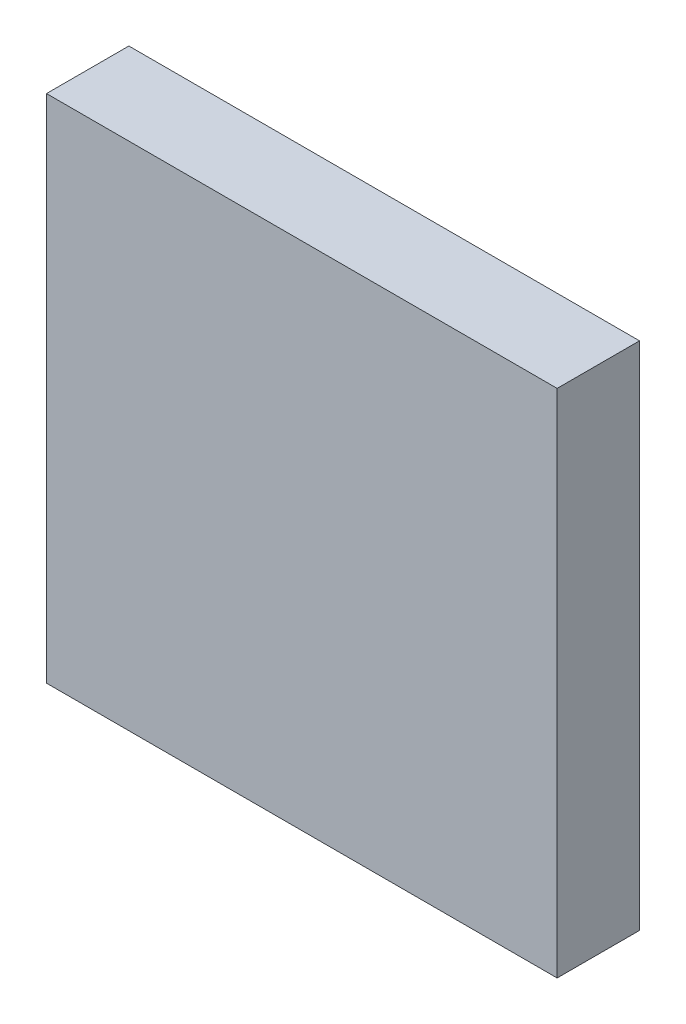
ISO-10303-21;
HEADER;
FILE_DESCRIPTION(('STEP AP214'),'2;1');
FILE_NAME('part.step','',(''),(''),'','','');
FILE_SCHEMA(('AUTOMOTIVE_DESIGN { 1 0 10303 214 1 1 1 1 }'));
ENDSEC;
DATA;
#1=APPLICATION_CONTEXT('core data for automotive mechanical design processes');
#2=APPLICATION_PROTOCOL_DEFINITION('international standard','automotive_design',2000,#1);
#3=PRODUCT_CONTEXT('',#1,'mechanical');
#4=PRODUCT('Part','Part','',(#3));
#5=PRODUCT_RELATED_PRODUCT_CATEGORY('part','',(#4));
#6=PRODUCT_DEFINITION_FORMATION('','',#4);
#7=PRODUCT_DEFINITION_CONTEXT('part definition',#1,'design');
#8=PRODUCT_DEFINITION('design','',#6,#7);
#9=PRODUCT_DEFINITION_SHAPE('','',#8);
#10=(LENGTH_UNIT() NAMED_UNIT(*) SI_UNIT(.MILLI.,.METRE.));
#11=(NAMED_UNIT(*) PLANE_ANGLE_UNIT() SI_UNIT($,.RADIAN.));
#12=(NAMED_UNIT(*) SI_UNIT($,.STERADIAN.) SOLID_ANGLE_UNIT());
#13=UNCERTAINTY_MEASURE_WITH_UNIT(LENGTH_MEASURE(1.E-05),#10,'distance_accuracy_value','');
#14=(GEOMETRIC_REPRESENTATION_CONTEXT(3) GLOBAL_UNCERTAINTY_ASSIGNED_CONTEXT((#13)) GLOBAL_UNIT_ASSIGNED_CONTEXT((#10,
#11,#12)) REPRESENTATION_CONTEXT('',''));
#15=CARTESIAN_POINT('',(0.,0.,0.));
#16=DIRECTION('',(0.,0.,1.));
#17=DIRECTION('',(1.,0.,0.));
#18=AXIS2_PLACEMENT_3D('',#15,#16,#17);
#19=CARTESIAN_POINT('',(-31.,-31.,10.));
#20=DIRECTION('',(0.,1.,0.));
#21=DIRECTION('',(0.,0.,1.));
#22=AXIS2_PLACEMENT_3D('',#19,#20,#21);
#23=PLANE('',#22);
#24=DIRECTION('',(1.,0.,0.));
#25=VECTOR('',#24,1.);
#26=CARTESIAN_POINT('',(-31.,-31.,0.));
#27=LINE('',#26,#25);
#28=CARTESIAN_POINT('',(-31.,-31.,0.));
#29=VERTEX_POINT('',#28);
#30=CARTESIAN_POINT('',(31.,-31.,0.));
#31=VERTEX_POINT('',#30);
#32=EDGE_CURVE('E138',#29,#31,#27,.T.);
#33=ORIENTED_EDGE('',*,*,#32,.T.);
#34=DIRECTION('',(0.,0.,-1.));
#35=VECTOR('',#34,1.);
#36=CARTESIAN_POINT('',(31.,-31.,10.));
#37=LINE('',#36,#35);
#38=CARTESIAN_POINT('',(31.,-31.,10.));
#39=VERTEX_POINT('',#38);
#40=EDGE_CURVE('E12',#39,#31,#37,.T.);
#41=ORIENTED_EDGE('',*,*,#40,.F.);
#42=DIRECTION('',(1.,0.,0.));
#43=VECTOR('',#42,1.);
#44=CARTESIAN_POINT('',(-31.,-31.,10.));
#45=LINE('',#44,#43);
#46=CARTESIAN_POINT('',(-31.,-31.,10.));
#47=VERTEX_POINT('',#46);
#48=EDGE_CURVE('E100',#47,#39,#45,.T.);
#49=ORIENTED_EDGE('',*,*,#48,.F.);
#50=DIRECTION('',(0.,0.,-1.));
#51=VECTOR('',#50,1.);
#52=CARTESIAN_POINT('',(-31.,-31.,10.));
#53=LINE('',#52,#51);
#54=EDGE_CURVE('E67',#47,#29,#53,.T.);
#55=ORIENTED_EDGE('',*,*,#54,.T.);
#56=EDGE_LOOP('',(#33,#41,#49,#55));
#57=FACE_BOUND('',#56,.T.);
#58=ADVANCED_FACE('F50',(#57),#23,.F.);
#59=CARTESIAN_POINT('',(31.,-31.,10.));
#60=DIRECTION('',(-1.,0.,0.));
#61=DIRECTION('',(0.,0.,1.));
#62=AXIS2_PLACEMENT_3D('',#59,#60,#61);
#63=PLANE('',#62);
#64=DIRECTION('',(0.,1.,0.));
#65=VECTOR('',#64,1.);
#66=CARTESIAN_POINT('',(31.,-31.,0.));
#67=LINE('',#66,#65);
#68=CARTESIAN_POINT('',(31.,31.,0.));
#69=VERTEX_POINT('',#68);
#70=EDGE_CURVE('E106',#31,#69,#67,.T.);
#71=ORIENTED_EDGE('',*,*,#70,.T.);
#72=DIRECTION('',(0.,0.,-1.));
#73=VECTOR('',#72,1.);
#74=CARTESIAN_POINT('',(31.,31.,10.));
#75=LINE('',#74,#73);
#76=CARTESIAN_POINT('',(31.,31.,10.));
#77=VERTEX_POINT('',#76);
#78=EDGE_CURVE('E59',#77,#69,#75,.T.);
#79=ORIENTED_EDGE('',*,*,#78,.F.);
#80=DIRECTION('',(0.,1.,0.));
#81=VECTOR('',#80,1.);
#82=CARTESIAN_POINT('',(31.,-31.,10.));
#83=LINE('',#82,#81);
#84=EDGE_CURVE('E92',#39,#77,#83,.T.);
#85=ORIENTED_EDGE('',*,*,#84,.F.);
#86=ORIENTED_EDGE('',*,*,#40,.T.);
#87=EDGE_LOOP('',(#71,#79,#85,#86));
#88=FACE_BOUND('',#87,.T.);
#89=ADVANCED_FACE('F105',(#88),#63,.F.);
#90=CARTESIAN_POINT('',(-31.,31.,10.));
#91=DIRECTION('',(0.,1.,0.));
#92=DIRECTION('',(0.,0.,1.));
#93=AXIS2_PLACEMENT_3D('',#90,#91,#92);
#94=PLANE('',#93);
#95=DIRECTION('',(1.,0.,0.));
#96=VECTOR('',#95,1.);
#97=CARTESIAN_POINT('',(-31.,31.,0.));
#98=LINE('',#97,#96);
#99=CARTESIAN_POINT('',(-31.,31.,0.));
#100=VERTEX_POINT('',#99);
#101=EDGE_CURVE('E127',#100,#69,#98,.T.);
#102=ORIENTED_EDGE('',*,*,#101,.F.);
#103=DIRECTION('',(0.,0.,-1.));
#104=VECTOR('',#103,1.);
#105=CARTESIAN_POINT('',(-31.,31.,10.));
#106=LINE('',#105,#104);
#107=CARTESIAN_POINT('',(-31.,31.,10.));
#108=VERTEX_POINT('',#107);
#109=EDGE_CURVE('E81',#108,#100,#106,.T.);
#110=ORIENTED_EDGE('',*,*,#109,.F.);
#111=DIRECTION('',(1.,0.,0.));
#112=VECTOR('',#111,1.);
#113=CARTESIAN_POINT('',(-31.,31.,10.));
#114=LINE('',#113,#112);
#115=EDGE_CURVE('E99',#108,#77,#114,.T.);
#116=ORIENTED_EDGE('',*,*,#115,.T.);
#117=ORIENTED_EDGE('',*,*,#78,.T.);
#118=EDGE_LOOP('',(#102,#110,#116,#117));
#119=FACE_BOUND('',#118,.T.);
#120=ADVANCED_FACE('F110',(#119),#94,.T.);
#121=CARTESIAN_POINT('',(-31.,-31.,10.));
#122=DIRECTION('',(-1.,0.,0.));
#123=DIRECTION('',(0.,0.,1.));
#124=AXIS2_PLACEMENT_3D('',#121,#122,#123);
#125=PLANE('',#124);
#126=DIRECTION('',(0.,1.,0.));
#127=VECTOR('',#126,1.);
#128=CARTESIAN_POINT('',(-31.,-31.,0.));
#129=LINE('',#128,#127);
#130=EDGE_CURVE('E124',#29,#100,#129,.T.);
#131=ORIENTED_EDGE('',*,*,#130,.F.);
#132=ORIENTED_EDGE('',*,*,#54,.F.);
#133=DIRECTION('',(0.,1.,0.));
#134=VECTOR('',#133,1.);
#135=CARTESIAN_POINT('',(-31.,-31.,10.));
#136=LINE('',#135,#134);
#137=EDGE_CURVE('E112',#47,#108,#136,.T.);
#138=ORIENTED_EDGE('',*,*,#137,.T.);
#139=ORIENTED_EDGE('',*,*,#109,.T.);
#140=EDGE_LOOP('',(#131,#132,#138,#139));
#141=FACE_BOUND('',#140,.T.);
#142=ADVANCED_FACE('F141',(#141),#125,.T.);
#143=CARTESIAN_POINT('',(0.,0.,10.));
#144=DIRECTION('',(0.,0.,1.));
#145=DIRECTION('',(1.,0.,0.));
#146=AXIS2_PLACEMENT_3D('',#143,#144,#145);
#147=PLANE('',#146);
#148=ORIENTED_EDGE('',*,*,#48,.T.);
#149=ORIENTED_EDGE('',*,*,#84,.T.);
#150=ORIENTED_EDGE('',*,*,#115,.F.);
#151=ORIENTED_EDGE('',*,*,#137,.F.);
#152=EDGE_LOOP('',(#148,#149,#150,#151));
#153=FACE_BOUND('',#152,.T.);
#154=ADVANCED_FACE('F96',(#153),#147,.T.);
#155=CARTESIAN_POINT('',(0.,0.,0.));
#156=DIRECTION('',(0.,0.,1.));
#157=DIRECTION('',(1.,0.,0.));
#158=AXIS2_PLACEMENT_3D('',#155,#156,#157);
#159=PLANE('',#158);
#160=ORIENTED_EDGE('',*,*,#32,.F.);
#161=ORIENTED_EDGE('',*,*,#130,.T.);
#162=ORIENTED_EDGE('',*,*,#101,.T.);
#163=ORIENTED_EDGE('',*,*,#70,.F.);
#164=EDGE_LOOP('',(#160,#161,#162,#163));
#165=FACE_BOUND('',#164,.T.);
#166=ADVANCED_FACE('F140',(#165),#159,.F.);
#167=CLOSED_SHELL('',(#58,#89,#120,#142,#154,#166));
#168=MANIFOLD_SOLID_BREP('B2',#167);
#169=ADVANCED_BREP_SHAPE_REPRESENTATION('',(#18,#168),#14);
#170=SHAPE_DEFINITION_REPRESENTATION(#9,#169);
ENDSEC;
END-ISO-10303-21;
